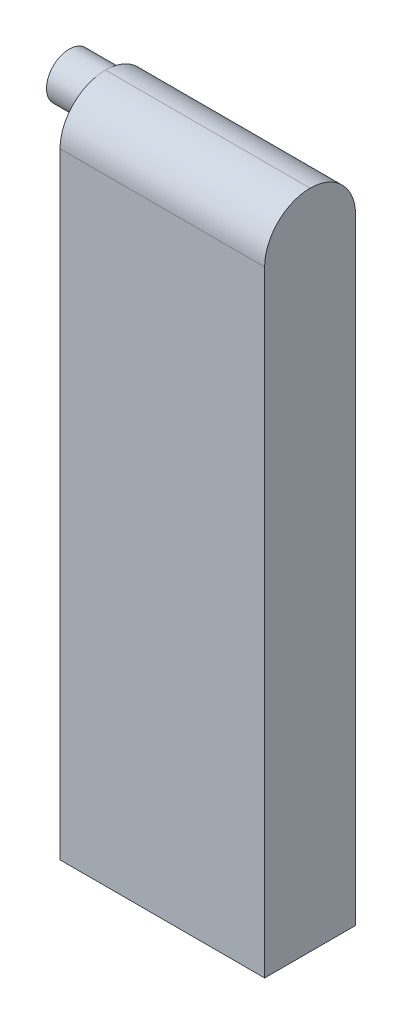
ISO-10303-21;
HEADER;
FILE_DESCRIPTION(('STEP AP214'),'2;1');
FILE_NAME('part.step','',(''),(''),'','','');
FILE_SCHEMA(('AUTOMOTIVE_DESIGN { 1 0 10303 214 1 1 1 1 }'));
ENDSEC;
DATA;
#1=APPLICATION_CONTEXT('core data for automotive mechanical design processes');
#2=APPLICATION_PROTOCOL_DEFINITION('international standard','automotive_design',2000,#1);
#3=PRODUCT_CONTEXT('',#1,'mechanical');
#4=PRODUCT('Part','Part','',(#3));
#5=PRODUCT_RELATED_PRODUCT_CATEGORY('part','',(#4));
#6=PRODUCT_DEFINITION_FORMATION('','',#4);
#7=PRODUCT_DEFINITION_CONTEXT('part definition',#1,'design');
#8=PRODUCT_DEFINITION('design','',#6,#7);
#9=PRODUCT_DEFINITION_SHAPE('','',#8);
#10=(LENGTH_UNIT() NAMED_UNIT(*) SI_UNIT(.MILLI.,.METRE.));
#11=(NAMED_UNIT(*) PLANE_ANGLE_UNIT() SI_UNIT($,.RADIAN.));
#12=(NAMED_UNIT(*) SI_UNIT($,.STERADIAN.) SOLID_ANGLE_UNIT());
#13=UNCERTAINTY_MEASURE_WITH_UNIT(LENGTH_MEASURE(1.E-05),#10,'distance_accuracy_value','');
#14=(GEOMETRIC_REPRESENTATION_CONTEXT(3) GLOBAL_UNCERTAINTY_ASSIGNED_CONTEXT((#13)) GLOBAL_UNIT_ASSIGNED_CONTEXT((#10,
#11,#12)) REPRESENTATION_CONTEXT('',''));
#15=CARTESIAN_POINT('',(0.,0.,0.));
#16=DIRECTION('',(0.,0.,1.));
#17=DIRECTION('',(1.,0.,0.));
#18=AXIS2_PLACEMENT_3D('',#15,#16,#17);
#19=CARTESIAN_POINT('',(0.,0.,20.));
#20=DIRECTION('',(-1.,0.,0.));
#21=DIRECTION('',(0.,0.,1.));
#22=AXIS2_PLACEMENT_3D('',#19,#20,#21);
#23=PLANE('',#22);
#24=DIRECTION('',(0.,1.,0.));
#25=VECTOR('',#24,1.);
#26=CARTESIAN_POINT('',(0.,0.,0.));
#27=LINE('',#26,#25);
#28=CARTESIAN_POINT('',(0.,0.,0.));
#29=VERTEX_POINT('',#28);
#30=CARTESIAN_POINT('',(0.,135.5,0.));
#31=VERTEX_POINT('',#30);
#32=EDGE_CURVE('E101',#29,#31,#27,.T.);
#33=ORIENTED_EDGE('',*,*,#32,.T.);
#34=CARTESIAN_POINT('',(0.,135.5,10.));
#35=DIRECTION('',(-1.,0.,0.));
#36=DIRECTION('',(0.,0.,1.));
#37=AXIS2_PLACEMENT_3D('',#34,#35,#36);
#38=CIRCLE('',#37,10.);
#39=CARTESIAN_POINT('',(0.,145.5,10.));
#40=VERTEX_POINT('',#39);
#41=EDGE_CURVE('E49',#31,#40,#38,.F.);
#42=ORIENTED_EDGE('',*,*,#41,.T.);
#43=CARTESIAN_POINT('',(0.,135.5,10.));
#44=DIRECTION('',(-1.,0.,0.));
#45=DIRECTION('',(0.,0.,1.));
#46=AXIS2_PLACEMENT_3D('',#43,#44,#45);
#47=CIRCLE('',#46,10.);
#48=CARTESIAN_POINT('',(0.,135.5,20.));
#49=VERTEX_POINT('',#48);
#50=EDGE_CURVE('E56',#40,#49,#47,.F.);
#51=ORIENTED_EDGE('',*,*,#50,.T.);
#52=DIRECTION('',(0.,1.,0.));
#53=VECTOR('',#52,1.);
#54=CARTESIAN_POINT('',(0.,0.,20.));
#55=LINE('',#54,#53);
#56=CARTESIAN_POINT('',(0.,0.,20.));
#57=VERTEX_POINT('',#56);
#58=EDGE_CURVE('E140',#57,#49,#55,.T.);
#59=ORIENTED_EDGE('',*,*,#58,.F.);
#60=DIRECTION('',(0.,0.,-1.));
#61=VECTOR('',#60,1.);
#62=CARTESIAN_POINT('',(0.,0.,20.));
#63=LINE('',#62,#61);
#64=EDGE_CURVE('E114',#57,#29,#63,.T.);
#65=ORIENTED_EDGE('',*,*,#64,.T.);
#66=EDGE_LOOP('',(#33,#42,#51,#59,#65));
#67=FACE_BOUND('',#66,.T.);
#68=ADVANCED_FACE('F39',(#67),#23,.F.);
#69=CARTESIAN_POINT('',(-45.,0.,20.));
#70=DIRECTION('',(1.,0.,0.));
#71=DIRECTION('',(0.,0.,-1.));
#72=AXIS2_PLACEMENT_3D('',#69,#70,#71);
#73=PLANE('',#72);
#74=CARTESIAN_POINT('',(-45.,135.5,10.));
#75=DIRECTION('',(1.,0.,0.));
#76=DIRECTION('',(0.,0.,-1.));
#77=AXIS2_PLACEMENT_3D('',#74,#75,#76);
#78=CIRCLE('',#77,10.);
#79=CARTESIAN_POINT('',(-45.,135.5,20.));
#80=VERTEX_POINT('',#79);
#81=CARTESIAN_POINT('',(-45.,145.5,10.));
#82=VERTEX_POINT('',#81);
#83=EDGE_CURVE('E94',#80,#82,#78,.F.);
#84=ORIENTED_EDGE('',*,*,#83,.T.);
#85=CARTESIAN_POINT('',(-45.,140.5,10.));
#86=DIRECTION('',(-1.,0.,0.));
#87=DIRECTION('',(0.,0.,1.));
#88=AXIS2_PLACEMENT_3D('',#85,#86,#87);
#89=CIRCLE('',#88,5.);
#90=EDGE_CURVE('E106',#82,#82,#89,.T.);
#91=ORIENTED_EDGE('',*,*,#90,.F.);
#92=CARTESIAN_POINT('',(-45.,135.5,10.));
#93=DIRECTION('',(1.,0.,0.));
#94=DIRECTION('',(0.,0.,-1.));
#95=AXIS2_PLACEMENT_3D('',#92,#93,#94);
#96=CIRCLE('',#95,10.);
#97=CARTESIAN_POINT('',(-45.,135.5,0.));
#98=VERTEX_POINT('',#97);
#99=EDGE_CURVE('E85',#82,#98,#96,.F.);
#100=ORIENTED_EDGE('',*,*,#99,.T.);
#101=DIRECTION('',(0.,-1.,0.));
#102=VECTOR('',#101,1.);
#103=CARTESIAN_POINT('',(-45.,0.,0.));
#104=LINE('',#103,#102);
#105=CARTESIAN_POINT('',(-45.,0.,0.));
#106=VERTEX_POINT('',#105);
#107=EDGE_CURVE('E127',#98,#106,#104,.T.);
#108=ORIENTED_EDGE('',*,*,#107,.T.);
#109=DIRECTION('',(0.,0.,-1.));
#110=VECTOR('',#109,1.);
#111=CARTESIAN_POINT('',(-45.,0.,20.));
#112=LINE('',#111,#110);
#113=CARTESIAN_POINT('',(-45.,0.,20.));
#114=VERTEX_POINT('',#113);
#115=EDGE_CURVE('E110',#114,#106,#112,.T.);
#116=ORIENTED_EDGE('',*,*,#115,.F.);
#117=DIRECTION('',(0.,-1.,0.));
#118=VECTOR('',#117,1.);
#119=CARTESIAN_POINT('',(-45.,0.,20.));
#120=LINE('',#119,#118);
#121=EDGE_CURVE('E108',#80,#114,#120,.T.);
#122=ORIENTED_EDGE('',*,*,#121,.F.);
#123=EDGE_LOOP('',(#84,#91,#100,#108,#116,#122));
#124=FACE_BOUND('',#123,.T.);
#125=ADVANCED_FACE('F104',(#124),#73,.F.);
#126=CARTESIAN_POINT('',(0.,0.,20.));
#127=DIRECTION('',(0.,1.,0.));
#128=DIRECTION('',(0.,0.,1.));
#129=AXIS2_PLACEMENT_3D('',#126,#127,#128);
#130=PLANE('',#129);
#131=DIRECTION('',(1.,0.,0.));
#132=VECTOR('',#131,1.);
#133=CARTESIAN_POINT('',(0.,0.,0.));
#134=LINE('',#133,#132);
#135=EDGE_CURVE('E133',#106,#29,#134,.T.);
#136=ORIENTED_EDGE('',*,*,#135,.T.);
#137=ORIENTED_EDGE('',*,*,#64,.F.);
#138=DIRECTION('',(1.,0.,0.));
#139=VECTOR('',#138,1.);
#140=CARTESIAN_POINT('',(0.,0.,20.));
#141=LINE('',#140,#139);
#142=EDGE_CURVE('E136',#114,#57,#141,.T.);
#143=ORIENTED_EDGE('',*,*,#142,.F.);
#144=ORIENTED_EDGE('',*,*,#115,.T.);
#145=EDGE_LOOP('',(#136,#137,#143,#144));
#146=FACE_BOUND('',#145,.T.);
#147=ADVANCED_FACE('F172',(#146),#130,.F.);
#148=CARTESIAN_POINT('',(0.,0.,20.));
#149=DIRECTION('',(0.,0.,1.));
#150=DIRECTION('',(1.,0.,0.));
#151=AXIS2_PLACEMENT_3D('',#148,#149,#150);
#152=PLANE('',#151);
#153=ORIENTED_EDGE('',*,*,#58,.T.);
#154=DIRECTION('',(-1.,0.,0.));
#155=VECTOR('',#154,1.);
#156=CARTESIAN_POINT('',(-45.,135.5,20.));
#157=LINE('',#156,#155);
#158=EDGE_CURVE('E11',#49,#80,#157,.T.);
#159=ORIENTED_EDGE('',*,*,#158,.T.);
#160=ORIENTED_EDGE('',*,*,#121,.T.);
#161=ORIENTED_EDGE('',*,*,#142,.T.);
#162=EDGE_LOOP('',(#153,#159,#160,#161));
#163=FACE_BOUND('',#162,.T.);
#164=ADVANCED_FACE('F177',(#163),#152,.T.);
#165=CARTESIAN_POINT('',(0.,0.,0.));
#166=DIRECTION('',(0.,0.,1.));
#167=DIRECTION('',(1.,0.,0.));
#168=AXIS2_PLACEMENT_3D('',#165,#166,#167);
#169=PLANE('',#168);
#170=ORIENTED_EDGE('',*,*,#107,.F.);
#171=DIRECTION('',(-1.,0.,0.));
#172=VECTOR('',#171,1.);
#173=CARTESIAN_POINT('',(0.,135.5,0.));
#174=LINE('',#173,#172);
#175=EDGE_CURVE('E89',#98,#31,#174,.F.);
#176=ORIENTED_EDGE('',*,*,#175,.T.);
#177=ORIENTED_EDGE('',*,*,#32,.F.);
#178=ORIENTED_EDGE('',*,*,#135,.F.);
#179=EDGE_LOOP('',(#170,#176,#177,#178));
#180=FACE_BOUND('',#179,.T.);
#181=ADVANCED_FACE('F125',(#180),#169,.F.);
#182=CARTESIAN_POINT('',(0.,135.5,10.));
#183=DIRECTION('',(1.,0.,0.));
#184=DIRECTION('',(0.,0.,-1.));
#185=AXIS2_PLACEMENT_3D('',#182,#183,#184);
#186=CYLINDRICAL_SURFACE('',#185,10.);
#187=ORIENTED_EDGE('',*,*,#158,.F.);
#188=ORIENTED_EDGE('',*,*,#50,.F.);
#189=DIRECTION('',(-1.,0.,0.));
#190=VECTOR('',#189,1.);
#191=CARTESIAN_POINT('',(0.,145.5,10.));
#192=LINE('',#191,#190);
#193=EDGE_CURVE('E43',#82,#40,#192,.F.);
#194=ORIENTED_EDGE('',*,*,#193,.F.);
#195=ORIENTED_EDGE('',*,*,#83,.F.);
#196=EDGE_LOOP('',(#187,#188,#194,#195));
#197=FACE_BOUND('',#196,.T.);
#198=ADVANCED_FACE('F41',(#197),#186,.T.);
#199=CARTESIAN_POINT('',(0.,135.5,10.));
#200=DIRECTION('',(-1.,0.,0.));
#201=DIRECTION('',(0.,0.,1.));
#202=AXIS2_PLACEMENT_3D('',#199,#200,#201);
#203=CYLINDRICAL_SURFACE('',#202,10.);
#204=ORIENTED_EDGE('',*,*,#41,.F.);
#205=ORIENTED_EDGE('',*,*,#175,.F.);
#206=ORIENTED_EDGE('',*,*,#99,.F.);
#207=ORIENTED_EDGE('',*,*,#193,.T.);
#208=EDGE_LOOP('',(#204,#205,#206,#207));
#209=FACE_BOUND('',#208,.T.);
#210=ADVANCED_FACE('F87',(#209),#203,.T.);
#211=CARTESIAN_POINT('',(-53.,140.5,10.));
#212=DIRECTION('',(1.,0.,0.));
#213=DIRECTION('',(0.,0.,-1.));
#214=AXIS2_PLACEMENT_3D('',#211,#212,#213);
#215=CYLINDRICAL_SURFACE('',#214,5.);
#216=CARTESIAN_POINT('',(-53.,140.5,10.));
#217=DIRECTION('',(-1.,0.,0.));
#218=DIRECTION('',(0.,0.,1.));
#219=AXIS2_PLACEMENT_3D('',#216,#217,#218);
#220=CIRCLE('',#219,5.);
#221=CARTESIAN_POINT('',(-53.,140.5,15.));
#222=VERTEX_POINT('',#221);
#223=EDGE_CURVE('E102',#222,#222,#220,.T.);
#224=ORIENTED_EDGE('',*,*,#223,.F.);
#225=EDGE_LOOP('',(#224));
#226=FACE_BOUND('',#225,.T.);
#227=ORIENTED_EDGE('',*,*,#90,.T.);
#228=EDGE_LOOP('',(#227));
#229=FACE_BOUND('',#228,.T.);
#230=ADVANCED_FACE('F157',(#226,#229),#215,.T.);
#231=CARTESIAN_POINT('',(-53.,140.5,10.));
#232=DIRECTION('',(-1.,0.,0.));
#233=DIRECTION('',(0.,0.,1.));
#234=AXIS2_PLACEMENT_3D('',#231,#232,#233);
#235=PLANE('',#234);
#236=ORIENTED_EDGE('',*,*,#223,.T.);
#237=EDGE_LOOP('',(#236));
#238=FACE_BOUND('',#237,.T.);
#239=ADVANCED_FACE('F155',(#238),#235,.T.);
#240=CLOSED_SHELL('',(#68,#125,#147,#164,#181,#198,#210,#230,#239));
#241=MANIFOLD_SOLID_BREP('B2',#240);
#242=ADVANCED_BREP_SHAPE_REPRESENTATION('',(#18,#241),#14);
#243=SHAPE_DEFINITION_REPRESENTATION(#9,#242);
ENDSEC;
END-ISO-10303-21;
